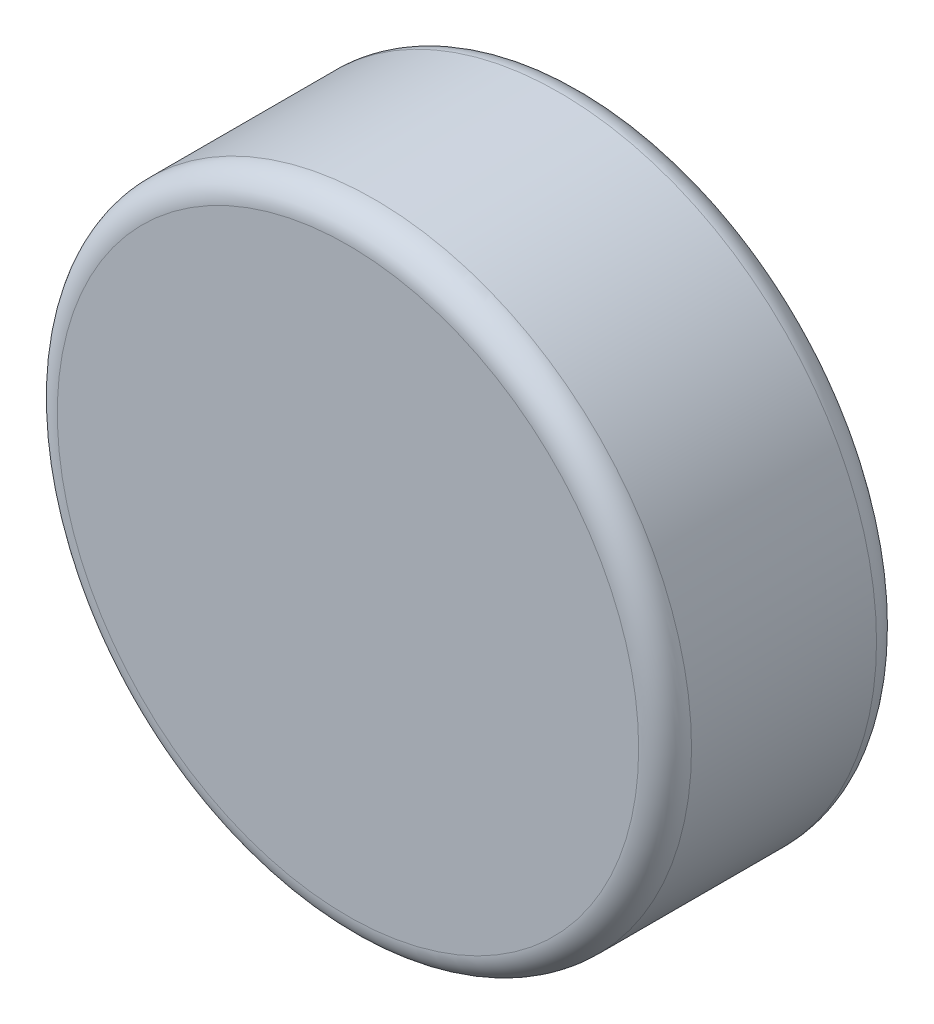
ISO-10303-21;
HEADER;
FILE_DESCRIPTION(('STEP AP214'),'2;1');
FILE_NAME('part.step','',(''),(''),'','','');
FILE_SCHEMA(('AUTOMOTIVE_DESIGN { 1 0 10303 214 1 1 1 1 }'));
ENDSEC;
DATA;
#1=APPLICATION_CONTEXT('core data for automotive mechanical design processes');
#2=APPLICATION_PROTOCOL_DEFINITION('international standard','automotive_design',2000,#1);
#3=PRODUCT_CONTEXT('',#1,'mechanical');
#4=PRODUCT('Part','Part','',(#3));
#5=PRODUCT_RELATED_PRODUCT_CATEGORY('part','',(#4));
#6=PRODUCT_DEFINITION_FORMATION('','',#4);
#7=PRODUCT_DEFINITION_CONTEXT('part definition',#1,'design');
#8=PRODUCT_DEFINITION('design','',#6,#7);
#9=PRODUCT_DEFINITION_SHAPE('','',#8);
#10=(LENGTH_UNIT() NAMED_UNIT(*) SI_UNIT(.MILLI.,.METRE.));
#11=(NAMED_UNIT(*) PLANE_ANGLE_UNIT() SI_UNIT($,.RADIAN.));
#12=(NAMED_UNIT(*) SI_UNIT($,.STERADIAN.) SOLID_ANGLE_UNIT());
#13=UNCERTAINTY_MEASURE_WITH_UNIT(LENGTH_MEASURE(1.E-05),#10,'distance_accuracy_value','');
#14=(GEOMETRIC_REPRESENTATION_CONTEXT(3) GLOBAL_UNCERTAINTY_ASSIGNED_CONTEXT((#13)) GLOBAL_UNIT_ASSIGNED_CONTEXT((#10,
#11,#12)) REPRESENTATION_CONTEXT('',''));
#15=CARTESIAN_POINT('',(0.,0.,0.));
#16=DIRECTION('',(0.,0.,1.));
#17=DIRECTION('',(1.,0.,0.));
#18=AXIS2_PLACEMENT_3D('',#15,#16,#17);
#19=CARTESIAN_POINT('',(0.,0.,22.86));
#20=DIRECTION('',(0.,0.,-1.));
#21=DIRECTION('',(-1.,0.,0.));
#22=AXIS2_PLACEMENT_3D('',#19,#20,#21);
#23=CYLINDRICAL_SURFACE('',#22,30.48);
#24=CARTESIAN_POINT('',(0.,0.,2.54));
#25=DIRECTION('',(0.,0.,1.));
#26=DIRECTION('',(1.,0.,0.));
#27=AXIS2_PLACEMENT_3D('',#24,#25,#26);
#28=CIRCLE('',#27,30.48);
#29=CARTESIAN_POINT('',(30.48,0.,2.54));
#30=VERTEX_POINT('',#29);
#31=EDGE_CURVE('E45',#30,#30,#28,.T.);
#32=ORIENTED_EDGE('',*,*,#31,.T.);
#33=EDGE_LOOP('',(#32));
#34=FACE_BOUND('',#33,.T.);
#35=CARTESIAN_POINT('',(0.,0.,20.32));
#36=DIRECTION('',(0.,0.,1.));
#37=DIRECTION('',(1.,0.,0.));
#38=AXIS2_PLACEMENT_3D('',#35,#36,#37);
#39=CIRCLE('',#38,30.48);
#40=CARTESIAN_POINT('',(30.48,0.,20.32));
#41=VERTEX_POINT('',#40);
#42=EDGE_CURVE('E50',#41,#41,#39,.F.);
#43=ORIENTED_EDGE('',*,*,#42,.T.);
#44=EDGE_LOOP('',(#43));
#45=FACE_BOUND('',#44,.T.);
#46=ADVANCED_FACE('F37',(#34,#45),#23,.T.);
#47=CARTESIAN_POINT('',(0.,0.,22.86));
#48=DIRECTION('',(0.,0.,1.));
#49=DIRECTION('',(1.,0.,0.));
#50=AXIS2_PLACEMENT_3D('',#47,#48,#49);
#51=PLANE('',#50);
#52=CARTESIAN_POINT('',(0.,0.,22.86));
#53=DIRECTION('',(0.,0.,1.));
#54=DIRECTION('',(1.,0.,0.));
#55=AXIS2_PLACEMENT_3D('',#52,#53,#54);
#56=CIRCLE('',#55,27.94);
#57=CARTESIAN_POINT('',(27.94,0.,22.86));
#58=VERTEX_POINT('',#57);
#59=EDGE_CURVE('E55',#58,#58,#56,.T.);
#60=ORIENTED_EDGE('',*,*,#59,.T.);
#61=EDGE_LOOP('',(#60));
#62=FACE_BOUND('',#61,.T.);
#63=ADVANCED_FACE('F62',(#62),#51,.T.);
#64=CARTESIAN_POINT('',(0.,0.,0.));
#65=DIRECTION('',(0.,0.,1.));
#66=DIRECTION('',(1.,0.,0.));
#67=AXIS2_PLACEMENT_3D('',#64,#65,#66);
#68=PLANE('',#67);
#69=CARTESIAN_POINT('',(0.,0.,0.));
#70=DIRECTION('',(0.,0.,1.));
#71=DIRECTION('',(1.,0.,0.));
#72=AXIS2_PLACEMENT_3D('',#69,#70,#71);
#73=CIRCLE('',#72,27.94);
#74=CARTESIAN_POINT('',(27.94,0.,0.));
#75=VERTEX_POINT('',#74);
#76=EDGE_CURVE('E10',#75,#75,#73,.F.);
#77=ORIENTED_EDGE('',*,*,#76,.T.);
#78=EDGE_LOOP('',(#77));
#79=FACE_BOUND('',#78,.T.);
#80=ADVANCED_FACE('F66',(#79),#68,.F.);
#81=CARTESIAN_POINT('',(0.,0.,20.32));
#82=DIRECTION('',(0.,0.,1.));
#83=DIRECTION('',(1.,0.,0.));
#84=AXIS2_PLACEMENT_3D('',#81,#82,#83);
#85=TOROIDAL_SURFACE('',#84,27.94,2.54);
#86=ORIENTED_EDGE('',*,*,#42,.F.);
#87=EDGE_LOOP('',(#86));
#88=FACE_BOUND('',#87,.T.);
#89=ORIENTED_EDGE('',*,*,#59,.F.);
#90=EDGE_LOOP('',(#89));
#91=FACE_BOUND('',#90,.T.);
#92=ADVANCED_FACE('F64',(#88,#91),#85,.T.);
#93=CARTESIAN_POINT('',(0.,0.,2.54));
#94=DIRECTION('',(0.,0.,1.));
#95=DIRECTION('',(1.,0.,0.));
#96=AXIS2_PLACEMENT_3D('',#93,#94,#95);
#97=TOROIDAL_SURFACE('',#96,27.94,2.54);
#98=ORIENTED_EDGE('',*,*,#76,.F.);
#99=EDGE_LOOP('',(#98));
#100=FACE_BOUND('',#99,.T.);
#101=ORIENTED_EDGE('',*,*,#31,.F.);
#102=EDGE_LOOP('',(#101));
#103=FACE_BOUND('',#102,.T.);
#104=ADVANCED_FACE('F39',(#100,#103),#97,.T.);
#105=CLOSED_SHELL('',(#46,#63,#80,#92,#104));
#106=MANIFOLD_SOLID_BREP('B2',#105);
#107=ADVANCED_BREP_SHAPE_REPRESENTATION('',(#18,#106),#14);
#108=SHAPE_DEFINITION_REPRESENTATION(#9,#107);
ENDSEC;
END-ISO-10303-21;
